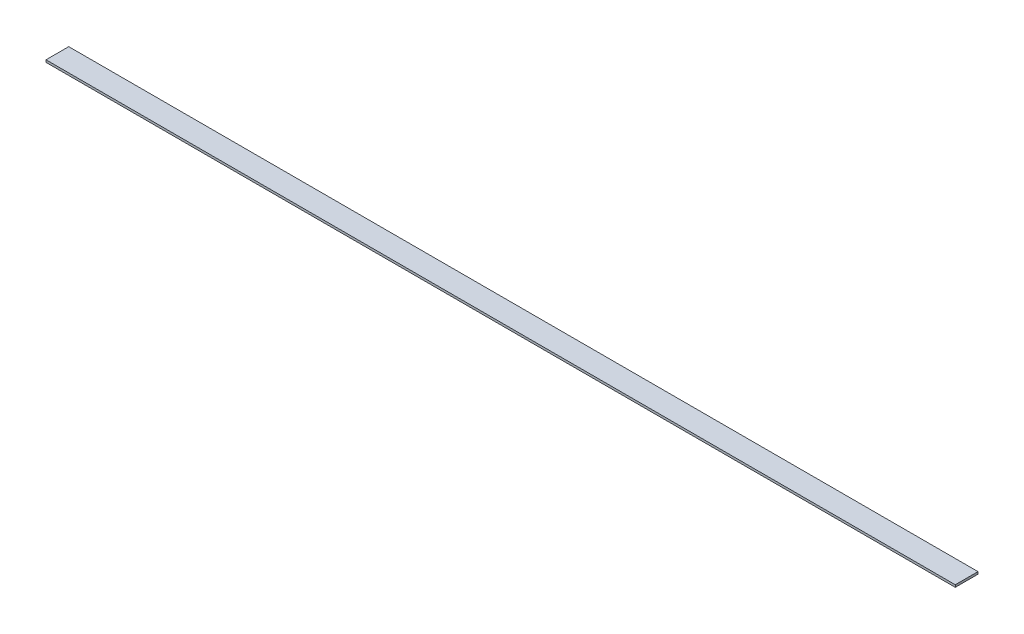
ISO-10303-21;
HEADER;
FILE_DESCRIPTION(('STEP AP214'),'2;1');
FILE_NAME('part.step','',(''),(''),'','','');
FILE_SCHEMA(('AUTOMOTIVE_DESIGN { 1 0 10303 214 1 1 1 1 }'));
ENDSEC;
DATA;
#1=APPLICATION_CONTEXT('core data for automotive mechanical design processes');
#2=APPLICATION_PROTOCOL_DEFINITION('international standard','automotive_design',2000,#1);
#3=PRODUCT_CONTEXT('',#1,'mechanical');
#4=PRODUCT('Part','Part','',(#3));
#5=PRODUCT_RELATED_PRODUCT_CATEGORY('part','',(#4));
#6=PRODUCT_DEFINITION_FORMATION('','',#4);
#7=PRODUCT_DEFINITION_CONTEXT('part definition',#1,'design');
#8=PRODUCT_DEFINITION('design','',#6,#7);
#9=PRODUCT_DEFINITION_SHAPE('','',#8);
#10=(LENGTH_UNIT() NAMED_UNIT(*) SI_UNIT(.MILLI.,.METRE.));
#11=(NAMED_UNIT(*) PLANE_ANGLE_UNIT() SI_UNIT($,.RADIAN.));
#12=(NAMED_UNIT(*) SI_UNIT($,.STERADIAN.) SOLID_ANGLE_UNIT());
#13=UNCERTAINTY_MEASURE_WITH_UNIT(LENGTH_MEASURE(1.E-05),#10,'distance_accuracy_value','');
#14=(GEOMETRIC_REPRESENTATION_CONTEXT(3) GLOBAL_UNCERTAINTY_ASSIGNED_CONTEXT((#13)) GLOBAL_UNIT_ASSIGNED_CONTEXT((#10,
#11,#12)) REPRESENTATION_CONTEXT('',''));
#15=CARTESIAN_POINT('',(0.,0.,0.));
#16=DIRECTION('',(0.,0.,1.));
#17=DIRECTION('',(1.,0.,0.));
#18=AXIS2_PLACEMENT_3D('',#15,#16,#17);
#19=CARTESIAN_POINT('',(-119.529411764706,0.254,-8.52413273001508));
#20=DIRECTION('',(1.,0.,0.));
#21=DIRECTION('',(0.,0.,-1.));
#22=AXIS2_PLACEMENT_3D('',#19,#20,#21);
#23=PLANE('',#22);
#24=DIRECTION('',(0.,0.,1.));
#25=VECTOR('',#24,1.);
#26=CARTESIAN_POINT('',(-119.529411764706,0.,-8.52413273001508));
#27=LINE('',#26,#25);
#28=CARTESIAN_POINT('',(-119.529411764706,0.,-8.52413273001508));
#29=VERTEX_POINT('',#28);
#30=CARTESIAN_POINT('',(-119.529411764706,0.,-5.98413273001508));
#31=VERTEX_POINT('',#30);
#32=EDGE_CURVE('E98',#29,#31,#27,.T.);
#33=ORIENTED_EDGE('',*,*,#32,.T.);
#34=DIRECTION('',(0.,-1.,0.));
#35=VECTOR('',#34,1.);
#36=CARTESIAN_POINT('',(-119.529411764706,0.254,-5.98413273001508));
#37=LINE('',#36,#35);
#38=CARTESIAN_POINT('',(-119.529411764706,0.254,-5.98413273001508));
#39=VERTEX_POINT('',#38);
#40=EDGE_CURVE('E11',#39,#31,#37,.T.);
#41=ORIENTED_EDGE('',*,*,#40,.F.);
#42=DIRECTION('',(0.,0.,1.));
#43=VECTOR('',#42,1.);
#44=CARTESIAN_POINT('',(-119.529411764706,0.254,-8.52413273001508));
#45=LINE('',#44,#43);
#46=CARTESIAN_POINT('',(-119.529411764706,0.254,-8.52413273001508));
#47=VERTEX_POINT('',#46);
#48=EDGE_CURVE('E86',#47,#39,#45,.T.);
#49=ORIENTED_EDGE('',*,*,#48,.F.);
#50=DIRECTION('',(0.,-1.,0.));
#51=VECTOR('',#50,1.);
#52=CARTESIAN_POINT('',(-119.529411764706,0.254,-8.52413273001508));
#53=LINE('',#52,#51);
#54=EDGE_CURVE('E94',#47,#29,#53,.T.);
#55=ORIENTED_EDGE('',*,*,#54,.T.);
#56=EDGE_LOOP('',(#33,#41,#49,#55));
#57=FACE_BOUND('',#56,.T.);
#58=ADVANCED_FACE('F35',(#57),#23,.F.);
#59=CARTESIAN_POINT('',(-119.529411764706,0.254,-5.98413273001508));
#60=DIRECTION('',(0.,0.,-1.));
#61=DIRECTION('',(-1.,0.,0.));
#62=AXIS2_PLACEMENT_3D('',#59,#60,#61);
#63=PLANE('',#62);
#64=DIRECTION('',(1.,0.,0.));
#65=VECTOR('',#64,1.);
#66=CARTESIAN_POINT('',(-119.529411764706,0.,-5.98413273001508));
#67=LINE('',#66,#65);
#68=CARTESIAN_POINT('',(-17.9294117647059,0.,-5.98413273001508));
#69=VERTEX_POINT('',#68);
#70=EDGE_CURVE('E90',#31,#69,#67,.T.);
#71=ORIENTED_EDGE('',*,*,#70,.T.);
#72=DIRECTION('',(0.,-1.,0.));
#73=VECTOR('',#72,1.);
#74=CARTESIAN_POINT('',(-17.9294117647059,0.254,-5.98413273001508));
#75=LINE('',#74,#73);
#76=CARTESIAN_POINT('',(-17.9294117647059,0.254,-5.98413273001508));
#77=VERTEX_POINT('',#76);
#78=EDGE_CURVE('E43',#77,#69,#75,.T.);
#79=ORIENTED_EDGE('',*,*,#78,.F.);
#80=DIRECTION('',(1.,0.,0.));
#81=VECTOR('',#80,1.);
#82=CARTESIAN_POINT('',(-119.529411764706,0.254,-5.98413273001508));
#83=LINE('',#82,#81);
#84=EDGE_CURVE('E81',#39,#77,#83,.T.);
#85=ORIENTED_EDGE('',*,*,#84,.F.);
#86=ORIENTED_EDGE('',*,*,#40,.T.);
#87=EDGE_LOOP('',(#71,#79,#85,#86));
#88=FACE_BOUND('',#87,.T.);
#89=ADVANCED_FACE('F89',(#88),#63,.F.);
#90=CARTESIAN_POINT('',(-17.9294117647059,0.254,-8.52413273001508));
#91=DIRECTION('',(-1.,0.,0.));
#92=DIRECTION('',(0.,0.,1.));
#93=AXIS2_PLACEMENT_3D('',#90,#91,#92);
#94=PLANE('',#93);
#95=DIRECTION('',(0.,0.,-1.));
#96=VECTOR('',#95,1.);
#97=CARTESIAN_POINT('',(-17.9294117647059,0.,-8.52413273001508));
#98=LINE('',#97,#96);
#99=CARTESIAN_POINT('',(-17.9294117647059,0.,-8.52413273001508));
#100=VERTEX_POINT('',#99);
#101=EDGE_CURVE('E68',#69,#100,#98,.T.);
#102=ORIENTED_EDGE('',*,*,#101,.T.);
#103=DIRECTION('',(0.,-1.,0.));
#104=VECTOR('',#103,1.);
#105=CARTESIAN_POINT('',(-17.9294117647059,0.254,-8.52413273001508));
#106=LINE('',#105,#104);
#107=CARTESIAN_POINT('',(-17.9294117647059,0.254,-8.52413273001508));
#108=VERTEX_POINT('',#107);
#109=EDGE_CURVE('E91',#108,#100,#106,.T.);
#110=ORIENTED_EDGE('',*,*,#109,.F.);
#111=DIRECTION('',(0.,0.,-1.));
#112=VECTOR('',#111,1.);
#113=CARTESIAN_POINT('',(-17.9294117647059,0.254,-8.52413273001508));
#114=LINE('',#113,#112);
#115=EDGE_CURVE('E84',#77,#108,#114,.T.);
#116=ORIENTED_EDGE('',*,*,#115,.F.);
#117=ORIENTED_EDGE('',*,*,#78,.T.);
#118=EDGE_LOOP('',(#102,#110,#116,#117));
#119=FACE_BOUND('',#118,.T.);
#120=ADVANCED_FACE('F92',(#119),#94,.F.);
#121=CARTESIAN_POINT('',(-119.529411764706,0.254,-8.52413273001508));
#122=DIRECTION('',(0.,0.,1.));
#123=DIRECTION('',(1.,0.,0.));
#124=AXIS2_PLACEMENT_3D('',#121,#122,#123);
#125=PLANE('',#124);
#126=DIRECTION('',(-1.,0.,0.));
#127=VECTOR('',#126,1.);
#128=CARTESIAN_POINT('',(-119.529411764706,0.,-8.52413273001508));
#129=LINE('',#128,#127);
#130=EDGE_CURVE('E74',#100,#29,#129,.T.);
#131=ORIENTED_EDGE('',*,*,#130,.T.);
#132=ORIENTED_EDGE('',*,*,#54,.F.);
#133=DIRECTION('',(-1.,0.,0.));
#134=VECTOR('',#133,1.);
#135=CARTESIAN_POINT('',(-119.529411764706,0.254,-8.52413273001508));
#136=LINE('',#135,#134);
#137=EDGE_CURVE('E51',#108,#47,#136,.T.);
#138=ORIENTED_EDGE('',*,*,#137,.F.);
#139=ORIENTED_EDGE('',*,*,#109,.T.);
#140=EDGE_LOOP('',(#131,#132,#138,#139));
#141=FACE_BOUND('',#140,.T.);
#142=ADVANCED_FACE('F105',(#141),#125,.F.);
#143=CARTESIAN_POINT('',(0.,0.254,0.));
#144=DIRECTION('',(0.,1.,0.));
#145=DIRECTION('',(0.,0.,1.));
#146=AXIS2_PLACEMENT_3D('',#143,#144,#145);
#147=PLANE('',#146);
#148=ORIENTED_EDGE('',*,*,#48,.T.);
#149=ORIENTED_EDGE('',*,*,#84,.T.);
#150=ORIENTED_EDGE('',*,*,#115,.T.);
#151=ORIENTED_EDGE('',*,*,#137,.T.);
#152=EDGE_LOOP('',(#148,#149,#150,#151));
#153=FACE_BOUND('',#152,.T.);
#154=ADVANCED_FACE('F82',(#153),#147,.T.);
#155=CARTESIAN_POINT('',(0.,0.,0.));
#156=DIRECTION('',(0.,1.,0.));
#157=DIRECTION('',(0.,0.,1.));
#158=AXIS2_PLACEMENT_3D('',#155,#156,#157);
#159=PLANE('',#158);
#160=ORIENTED_EDGE('',*,*,#32,.F.);
#161=ORIENTED_EDGE('',*,*,#130,.F.);
#162=ORIENTED_EDGE('',*,*,#101,.F.);
#163=ORIENTED_EDGE('',*,*,#70,.F.);
#164=EDGE_LOOP('',(#160,#161,#162,#163));
#165=FACE_BOUND('',#164,.T.);
#166=ADVANCED_FACE('F108',(#165),#159,.F.);
#167=CLOSED_SHELL('',(#58,#89,#120,#142,#154,#166));
#168=MANIFOLD_SOLID_BREP('B2',#167);
#169=ADVANCED_BREP_SHAPE_REPRESENTATION('',(#18,#168),#14);
#170=SHAPE_DEFINITION_REPRESENTATION(#9,#169);
ENDSEC;
END-ISO-10303-21;
